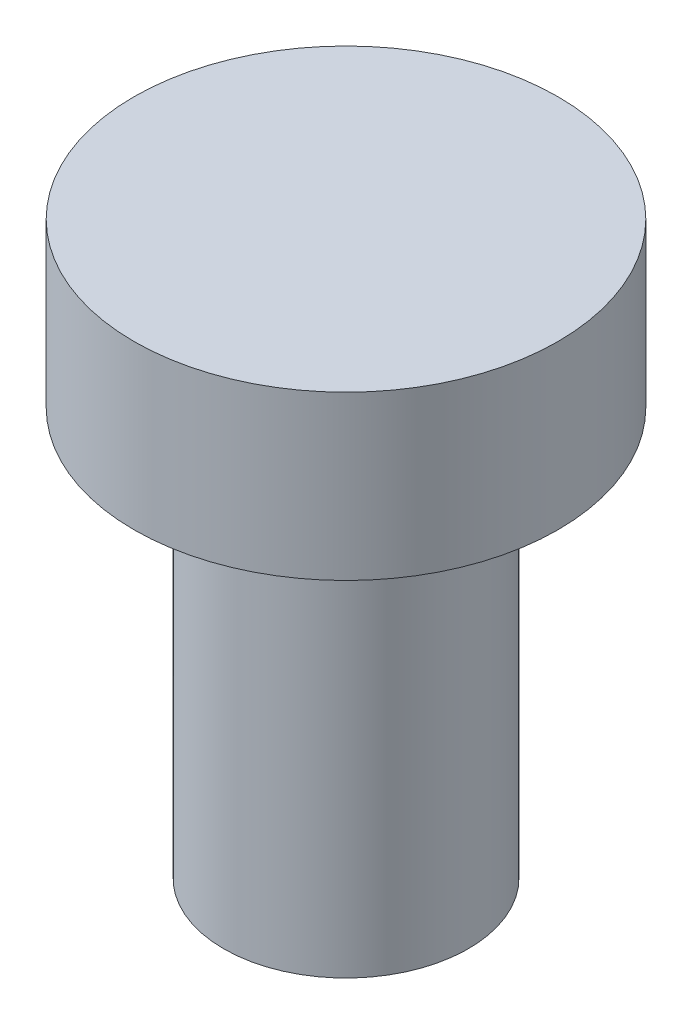
ISO-10303-21;
HEADER;
FILE_DESCRIPTION(('STEP AP214'),'2;1');
FILE_NAME('part.step','',(''),(''),'','','');
FILE_SCHEMA(('AUTOMOTIVE_DESIGN { 1 0 10303 214 1 1 1 1 }'));
ENDSEC;
DATA;
#1=APPLICATION_CONTEXT('core data for automotive mechanical design processes');
#2=APPLICATION_PROTOCOL_DEFINITION('international standard','automotive_design',2000,#1);
#3=PRODUCT_CONTEXT('',#1,'mechanical');
#4=PRODUCT('Part','Part','',(#3));
#5=PRODUCT_RELATED_PRODUCT_CATEGORY('part','',(#4));
#6=PRODUCT_DEFINITION_FORMATION('','',#4);
#7=PRODUCT_DEFINITION_CONTEXT('part definition',#1,'design');
#8=PRODUCT_DEFINITION('design','',#6,#7);
#9=PRODUCT_DEFINITION_SHAPE('','',#8);
#10=(LENGTH_UNIT() NAMED_UNIT(*) SI_UNIT(.MILLI.,.METRE.));
#11=(NAMED_UNIT(*) PLANE_ANGLE_UNIT() SI_UNIT($,.RADIAN.));
#12=(NAMED_UNIT(*) SI_UNIT($,.STERADIAN.) SOLID_ANGLE_UNIT());
#13=UNCERTAINTY_MEASURE_WITH_UNIT(LENGTH_MEASURE(1.E-05),#10,'distance_accuracy_value','');
#14=(GEOMETRIC_REPRESENTATION_CONTEXT(3) GLOBAL_UNCERTAINTY_ASSIGNED_CONTEXT((#13)) GLOBAL_UNIT_ASSIGNED_CONTEXT((#10,
#11,#12)) REPRESENTATION_CONTEXT('',''));
#15=CARTESIAN_POINT('',(0.,0.,0.));
#16=DIRECTION('',(0.,0.,1.));
#17=DIRECTION('',(1.,0.,0.));
#18=AXIS2_PLACEMENT_3D('',#15,#16,#17);
#19=CARTESIAN_POINT('',(0.,5.,0.));
#20=DIRECTION('',(0.,-1.,0.));
#21=DIRECTION('',(0.,0.,-1.));
#22=AXIS2_PLACEMENT_3D('',#19,#20,#21);
#23=CYLINDRICAL_SURFACE('',#22,1.5);
#24=CARTESIAN_POINT('',(0.,5.,0.));
#25=DIRECTION('',(0.,1.,0.));
#26=DIRECTION('',(0.,0.,1.));
#27=AXIS2_PLACEMENT_3D('',#24,#25,#26);
#28=CIRCLE('',#27,1.5);
#29=CARTESIAN_POINT('',(0.,5.,1.5));
#30=VERTEX_POINT('',#29);
#31=EDGE_CURVE('E10',#30,#30,#28,.T.);
#32=ORIENTED_EDGE('',*,*,#31,.F.);
#33=EDGE_LOOP('',(#32));
#34=FACE_BOUND('',#33,.T.);
#35=CARTESIAN_POINT('',(0.,0.,0.));
#36=DIRECTION('',(0.,1.,0.));
#37=DIRECTION('',(0.,0.,1.));
#38=AXIS2_PLACEMENT_3D('',#35,#36,#37);
#39=CIRCLE('',#38,1.5);
#40=CARTESIAN_POINT('',(0.,0.,1.5));
#41=VERTEX_POINT('',#40);
#42=EDGE_CURVE('E34',#41,#41,#39,.T.);
#43=ORIENTED_EDGE('',*,*,#42,.T.);
#44=EDGE_LOOP('',(#43));
#45=FACE_BOUND('',#44,.T.);
#46=ADVANCED_FACE('F31',(#34,#45),#23,.T.);
#47=CARTESIAN_POINT('',(0.,0.,0.));
#48=DIRECTION('',(0.,1.,0.));
#49=DIRECTION('',(0.,0.,1.));
#50=AXIS2_PLACEMENT_3D('',#47,#48,#49);
#51=PLANE('',#50);
#52=ORIENTED_EDGE('',*,*,#42,.F.);
#53=EDGE_LOOP('',(#52));
#54=FACE_BOUND('',#53,.T.);
#55=ADVANCED_FACE('F54',(#54),#51,.F.);
#56=CARTESIAN_POINT('',(0.,7.,0.));
#57=DIRECTION('',(0.,-1.,0.));
#58=DIRECTION('',(0.,0.,-1.));
#59=AXIS2_PLACEMENT_3D('',#56,#57,#58);
#60=CYLINDRICAL_SURFACE('',#59,2.6);
#61=CARTESIAN_POINT('',(0.,7.,0.));
#62=DIRECTION('',(0.,1.,0.));
#63=DIRECTION('',(0.,0.,1.));
#64=AXIS2_PLACEMENT_3D('',#61,#62,#63);
#65=CIRCLE('',#64,2.6);
#66=CARTESIAN_POINT('',(0.,7.,2.6));
#67=VERTEX_POINT('',#66);
#68=EDGE_CURVE('E41',#67,#67,#65,.T.);
#69=ORIENTED_EDGE('',*,*,#68,.F.);
#70=EDGE_LOOP('',(#69));
#71=FACE_BOUND('',#70,.T.);
#72=CARTESIAN_POINT('',(0.,5.,0.));
#73=DIRECTION('',(0.,1.,0.));
#74=DIRECTION('',(0.,0.,1.));
#75=AXIS2_PLACEMENT_3D('',#72,#73,#74);
#76=CIRCLE('',#75,2.6);
#77=CARTESIAN_POINT('',(0.,5.,2.6));
#78=VERTEX_POINT('',#77);
#79=EDGE_CURVE('E43',#78,#78,#76,.T.);
#80=ORIENTED_EDGE('',*,*,#79,.T.);
#81=EDGE_LOOP('',(#80));
#82=FACE_BOUND('',#81,.T.);
#83=ADVANCED_FACE('F51',(#71,#82),#60,.T.);
#84=CARTESIAN_POINT('',(0.,7.,0.));
#85=DIRECTION('',(0.,1.,0.));
#86=DIRECTION('',(0.,0.,1.));
#87=AXIS2_PLACEMENT_3D('',#84,#85,#86);
#88=PLANE('',#87);
#89=ORIENTED_EDGE('',*,*,#68,.T.);
#90=EDGE_LOOP('',(#89));
#91=FACE_BOUND('',#90,.T.);
#92=ADVANCED_FACE('F49',(#91),#88,.T.);
#93=CARTESIAN_POINT('',(0.,5.,0.));
#94=DIRECTION('',(0.,1.,0.));
#95=DIRECTION('',(0.,0.,1.));
#96=AXIS2_PLACEMENT_3D('',#93,#94,#95);
#97=PLANE('',#96);
#98=ORIENTED_EDGE('',*,*,#31,.T.);
#99=EDGE_LOOP('',(#98));
#100=FACE_BOUND('',#99,.T.);
#101=ORIENTED_EDGE('',*,*,#79,.F.);
#102=EDGE_LOOP('',(#101));
#103=FACE_BOUND('',#102,.T.);
#104=ADVANCED_FACE('F58',(#100,#103),#97,.F.);
#105=CLOSED_SHELL('',(#46,#55,#83,#92,#104));
#106=MANIFOLD_SOLID_BREP('B2',#105);
#107=ADVANCED_BREP_SHAPE_REPRESENTATION('',(#18,#106),#14);
#108=SHAPE_DEFINITION_REPRESENTATION(#9,#107);
ENDSEC;
END-ISO-10303-21;
